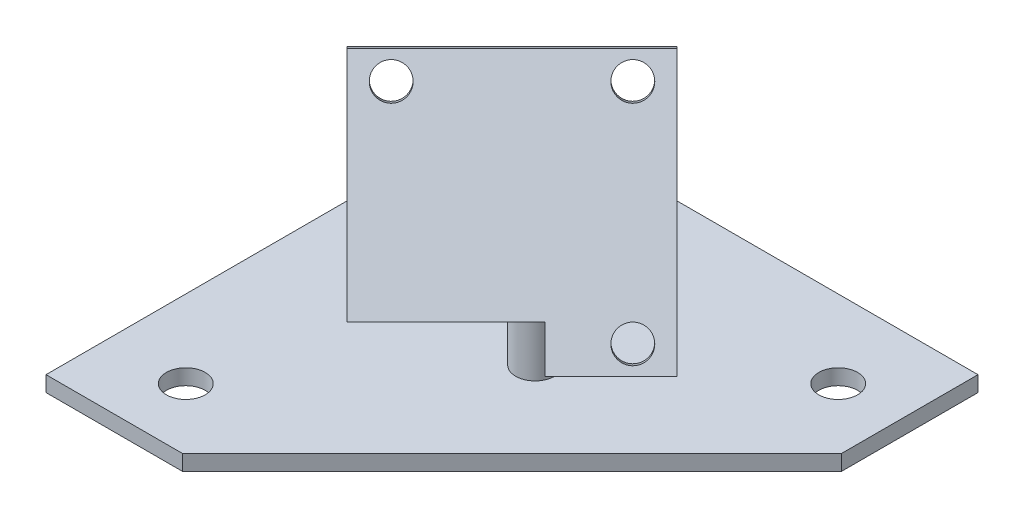
ISO-10303-21;
HEADER;
FILE_DESCRIPTION(('STEP AP214'),'2;1');
FILE_NAME('part.step','',(''),(''),'','','');
FILE_SCHEMA(('AUTOMOTIVE_DESIGN { 1 0 10303 214 1 1 1 1 }'));
ENDSEC;
DATA;
#1=APPLICATION_CONTEXT('core data for automotive mechanical design processes');
#2=APPLICATION_PROTOCOL_DEFINITION('international standard','automotive_design',2000,#1);
#3=PRODUCT_CONTEXT('',#1,'mechanical');
#4=PRODUCT('Part','Part','',(#3));
#5=PRODUCT_RELATED_PRODUCT_CATEGORY('part','',(#4));
#6=PRODUCT_DEFINITION_FORMATION('','',#4);
#7=PRODUCT_DEFINITION_CONTEXT('part definition',#1,'design');
#8=PRODUCT_DEFINITION('design','',#6,#7);
#9=PRODUCT_DEFINITION_SHAPE('','',#8);
#10=(LENGTH_UNIT() NAMED_UNIT(*) SI_UNIT(.MILLI.,.METRE.));
#11=(NAMED_UNIT(*) PLANE_ANGLE_UNIT() SI_UNIT($,.RADIAN.));
#12=(NAMED_UNIT(*) SI_UNIT($,.STERADIAN.) SOLID_ANGLE_UNIT());
#13=UNCERTAINTY_MEASURE_WITH_UNIT(LENGTH_MEASURE(1.E-05),#10,'distance_accuracy_value','');
#14=(GEOMETRIC_REPRESENTATION_CONTEXT(3) GLOBAL_UNCERTAINTY_ASSIGNED_CONTEXT((#13)) GLOBAL_UNIT_ASSIGNED_CONTEXT((#10,
#11,#12)) REPRESENTATION_CONTEXT('',''));
#15=CARTESIAN_POINT('',(0.,0.,0.));
#16=DIRECTION('',(0.,0.,1.));
#17=DIRECTION('',(1.,0.,0.));
#18=AXIS2_PLACEMENT_3D('',#15,#16,#17);
#19=CARTESIAN_POINT('',(0.,2.,0.));
#20=DIRECTION('',(0.,0.,-1.));
#21=DIRECTION('',(-1.,0.,0.));
#22=AXIS2_PLACEMENT_3D('',#19,#20,#21);
#23=PLANE('',#22);
#24=DIRECTION('',(1.,0.,0.));
#25=VECTOR('',#24,1.);
#26=CARTESIAN_POINT('',(0.,0.,0.));
#27=LINE('',#26,#25);
#28=CARTESIAN_POINT('',(20.,0.,0.));
#29=VERTEX_POINT('',#28);
#30=CARTESIAN_POINT('',(60.,0.,0.));
#31=VERTEX_POINT('',#30);
#32=EDGE_CURVE('E135',#29,#31,#27,.T.);
#33=ORIENTED_EDGE('',*,*,#32,.F.);
#34=DIRECTION('',(0.,-1.,0.));
#35=VECTOR('',#34,1.);
#36=CARTESIAN_POINT('',(20.,2.,0.));
#37=LINE('',#36,#35);
#38=CARTESIAN_POINT('',(20.,2.,0.));
#39=VERTEX_POINT('',#38);
#40=EDGE_CURVE('E11',#39,#29,#37,.T.);
#41=ORIENTED_EDGE('',*,*,#40,.F.);
#42=DIRECTION('',(1.,0.,0.));
#43=VECTOR('',#42,1.);
#44=CARTESIAN_POINT('',(0.,2.,0.));
#45=LINE('',#44,#43);
#46=CARTESIAN_POINT('',(60.,2.,0.));
#47=VERTEX_POINT('',#46);
#48=EDGE_CURVE('E173',#39,#47,#45,.T.);
#49=ORIENTED_EDGE('',*,*,#48,.T.);
#50=DIRECTION('',(0.,-1.,0.));
#51=VECTOR('',#50,1.);
#52=CARTESIAN_POINT('',(60.,2.,0.));
#53=LINE('',#52,#51);
#54=EDGE_CURVE('E52',#47,#31,#53,.T.);
#55=ORIENTED_EDGE('',*,*,#54,.T.);
#56=EDGE_LOOP('',(#33,#41,#49,#55));
#57=FACE_BOUND('',#56,.T.);
#58=ADVANCED_FACE('F35',(#57),#23,.T.);
#59=CARTESIAN_POINT('',(20.,2.,0.));
#60=DIRECTION('',(1.,0.,0.));
#61=DIRECTION('',(0.,0.,-1.));
#62=AXIS2_PLACEMENT_3D('',#59,#60,#61);
#63=PLANE('',#62);
#64=DIRECTION('',(0.,0.,1.));
#65=VECTOR('',#64,1.);
#66=CARTESIAN_POINT('',(20.,0.,0.));
#67=LINE('',#66,#65);
#68=CARTESIAN_POINT('',(20.,0.,20.));
#69=VERTEX_POINT('',#68);
#70=EDGE_CURVE('E137',#29,#69,#67,.T.);
#71=ORIENTED_EDGE('',*,*,#70,.T.);
#72=DIRECTION('',(0.,-1.,0.));
#73=VECTOR('',#72,1.);
#74=CARTESIAN_POINT('',(20.,2.,20.));
#75=LINE('',#74,#73);
#76=CARTESIAN_POINT('',(20.,2.,20.));
#77=VERTEX_POINT('',#76);
#78=EDGE_CURVE('E44',#77,#69,#75,.T.);
#79=ORIENTED_EDGE('',*,*,#78,.F.);
#80=DIRECTION('',(0.,0.,1.));
#81=VECTOR('',#80,1.);
#82=CARTESIAN_POINT('',(20.,2.,0.));
#83=LINE('',#82,#81);
#84=EDGE_CURVE('E171',#39,#77,#83,.T.);
#85=ORIENTED_EDGE('',*,*,#84,.F.);
#86=ORIENTED_EDGE('',*,*,#40,.T.);
#87=EDGE_LOOP('',(#71,#79,#85,#86));
#88=FACE_BOUND('',#87,.T.);
#89=ADVANCED_FACE('F165',(#88),#63,.F.);
#90=CARTESIAN_POINT('',(0.,2.,20.));
#91=DIRECTION('',(0.,0.,-1.));
#92=DIRECTION('',(-1.,0.,0.));
#93=AXIS2_PLACEMENT_3D('',#90,#91,#92);
#94=PLANE('',#93);
#95=DIRECTION('',(1.,0.,0.));
#96=VECTOR('',#95,1.);
#97=CARTESIAN_POINT('',(0.,0.,20.));
#98=LINE('',#97,#96);
#99=CARTESIAN_POINT('',(0.,0.,20.));
#100=VERTEX_POINT('',#99);
#101=EDGE_CURVE('E140',#100,#69,#98,.T.);
#102=ORIENTED_EDGE('',*,*,#101,.F.);
#103=DIRECTION('',(0.,-1.,0.));
#104=VECTOR('',#103,1.);
#105=CARTESIAN_POINT('',(0.,2.,20.));
#106=LINE('',#105,#104);
#107=CARTESIAN_POINT('',(0.,2.,20.));
#108=VERTEX_POINT('',#107);
#109=EDGE_CURVE('E156',#108,#100,#106,.T.);
#110=ORIENTED_EDGE('',*,*,#109,.F.);
#111=DIRECTION('',(1.,0.,0.));
#112=VECTOR('',#111,1.);
#113=CARTESIAN_POINT('',(0.,2.,20.));
#114=LINE('',#113,#112);
#115=EDGE_CURVE('E162',#108,#77,#114,.T.);
#116=ORIENTED_EDGE('',*,*,#115,.T.);
#117=ORIENTED_EDGE('',*,*,#78,.T.);
#118=EDGE_LOOP('',(#102,#110,#116,#117));
#119=FACE_BOUND('',#118,.T.);
#120=ADVANCED_FACE('F161',(#119),#94,.T.);
#121=CARTESIAN_POINT('',(0.,2.,0.));
#122=DIRECTION('',(1.,0.,0.));
#123=DIRECTION('',(0.,0.,-1.));
#124=AXIS2_PLACEMENT_3D('',#121,#122,#123);
#125=PLANE('',#124);
#126=DIRECTION('',(0.,0.,1.));
#127=VECTOR('',#126,1.);
#128=CARTESIAN_POINT('',(0.,0.,0.));
#129=LINE('',#128,#127);
#130=CARTESIAN_POINT('',(0.,0.,60.));
#131=VERTEX_POINT('',#130);
#132=EDGE_CURVE('E143',#100,#131,#129,.T.);
#133=ORIENTED_EDGE('',*,*,#132,.T.);
#134=DIRECTION('',(0.,-1.,0.));
#135=VECTOR('',#134,1.);
#136=CARTESIAN_POINT('',(0.,2.,60.));
#137=LINE('',#136,#135);
#138=CARTESIAN_POINT('',(0.,2.,60.));
#139=VERTEX_POINT('',#138);
#140=EDGE_CURVE('E120',#139,#131,#137,.T.);
#141=ORIENTED_EDGE('',*,*,#140,.F.);
#142=DIRECTION('',(0.,0.,1.));
#143=VECTOR('',#142,1.);
#144=CARTESIAN_POINT('',(0.,2.,0.));
#145=LINE('',#144,#143);
#146=EDGE_CURVE('E109',#108,#139,#145,.T.);
#147=ORIENTED_EDGE('',*,*,#146,.F.);
#148=ORIENTED_EDGE('',*,*,#109,.T.);
#149=EDGE_LOOP('',(#133,#141,#147,#148));
#150=FACE_BOUND('',#149,.T.);
#151=ADVANCED_FACE('F170',(#150),#125,.F.);
#152=CARTESIAN_POINT('',(0.,2.,60.));
#153=DIRECTION('',(0.,0.,-1.));
#154=DIRECTION('',(-1.,0.,0.));
#155=AXIS2_PLACEMENT_3D('',#152,#153,#154);
#156=PLANE('',#155);
#157=DIRECTION('',(1.,0.,0.));
#158=VECTOR('',#157,1.);
#159=CARTESIAN_POINT('',(0.,0.,60.));
#160=LINE('',#159,#158);
#161=CARTESIAN_POINT('',(17.5735931288071,0.,60.));
#162=VERTEX_POINT('',#161);
#163=EDGE_CURVE('E117',#131,#162,#160,.T.);
#164=ORIENTED_EDGE('',*,*,#163,.T.);
#165=DIRECTION('',(0.,-1.,0.));
#166=VECTOR('',#165,1.);
#167=CARTESIAN_POINT('',(17.5735931288071,2.,60.));
#168=LINE('',#167,#166);
#169=CARTESIAN_POINT('',(17.5735931288071,2.,60.));
#170=VERTEX_POINT('',#169);
#171=EDGE_CURVE('E115',#170,#162,#168,.T.);
#172=ORIENTED_EDGE('',*,*,#171,.F.);
#173=DIRECTION('',(1.,0.,0.));
#174=VECTOR('',#173,1.);
#175=CARTESIAN_POINT('',(0.,2.,60.));
#176=LINE('',#175,#174);
#177=EDGE_CURVE('E100',#139,#170,#176,.T.);
#178=ORIENTED_EDGE('',*,*,#177,.F.);
#179=ORIENTED_EDGE('',*,*,#140,.T.);
#180=EDGE_LOOP('',(#164,#172,#178,#179));
#181=FACE_BOUND('',#180,.T.);
#182=ADVANCED_FACE('F116',(#181),#156,.F.);
#183=CARTESIAN_POINT('',(38.7867965644036,2.,38.7867965644036));
#184=DIRECTION('',(0.707106781186547,0.,0.707106781186547));
#185=DIRECTION('',(0.707106781186548,0.,-0.707106781186548));
#186=AXIS2_PLACEMENT_3D('',#183,#184,#185);
#187=PLANE('',#186);
#188=DIRECTION('',(-0.707106781186548,0.,0.707106781186548));
#189=VECTOR('',#188,1.);
#190=CARTESIAN_POINT('',(38.7867965644036,0.,38.7867965644036));
#191=LINE('',#190,#189);
#192=CARTESIAN_POINT('',(60.,0.,17.5735931288071));
#193=VERTEX_POINT('',#192);
#194=EDGE_CURVE('E147',#193,#162,#191,.T.);
#195=ORIENTED_EDGE('',*,*,#194,.F.);
#196=DIRECTION('',(0.,-1.,0.));
#197=VECTOR('',#196,1.);
#198=CARTESIAN_POINT('',(60.,2.,17.5735931288071));
#199=LINE('',#198,#197);
#200=CARTESIAN_POINT('',(60.,2.,17.5735931288071));
#201=VERTEX_POINT('',#200);
#202=EDGE_CURVE('E75',#201,#193,#199,.T.);
#203=ORIENTED_EDGE('',*,*,#202,.F.);
#204=DIRECTION('',(-0.707106781186548,0.,0.707106781186548));
#205=VECTOR('',#204,1.);
#206=CARTESIAN_POINT('',(38.7867965644036,2.,38.7867965644036));
#207=LINE('',#206,#205);
#208=EDGE_CURVE('E106',#201,#170,#207,.T.);
#209=ORIENTED_EDGE('',*,*,#208,.T.);
#210=ORIENTED_EDGE('',*,*,#171,.T.);
#211=EDGE_LOOP('',(#195,#203,#209,#210));
#212=FACE_BOUND('',#211,.T.);
#213=ADVANCED_FACE('F122',(#212),#187,.T.);
#214=CARTESIAN_POINT('',(10.,2.,52.));
#215=DIRECTION('',(0.,-1.,0.));
#216=DIRECTION('',(0.,0.,-1.));
#217=AXIS2_PLACEMENT_3D('',#214,#215,#216);
#218=CYLINDRICAL_SURFACE('',#217,2.5);
#219=CARTESIAN_POINT('',(10.,2.,52.));
#220=DIRECTION('',(0.,1.,0.));
#221=DIRECTION('',(0.,0.,1.));
#222=AXIS2_PLACEMENT_3D('',#219,#220,#221);
#223=CIRCLE('',#222,2.5);
#224=CARTESIAN_POINT('',(10.,2.,54.5));
#225=VERTEX_POINT('',#224);
#226=EDGE_CURVE('E177',#225,#225,#223,.T.);
#227=ORIENTED_EDGE('',*,*,#226,.T.);
#228=EDGE_LOOP('',(#227));
#229=FACE_BOUND('',#228,.T.);
#230=CARTESIAN_POINT('',(10.,0.,52.));
#231=DIRECTION('',(0.,1.,0.));
#232=DIRECTION('',(0.,0.,1.));
#233=AXIS2_PLACEMENT_3D('',#230,#231,#232);
#234=CIRCLE('',#233,2.5);
#235=CARTESIAN_POINT('',(10.,0.,54.5));
#236=VERTEX_POINT('',#235);
#237=EDGE_CURVE('E131',#236,#236,#234,.T.);
#238=ORIENTED_EDGE('',*,*,#237,.F.);
#239=EDGE_LOOP('',(#238));
#240=FACE_BOUND('',#239,.T.);
#241=ADVANCED_FACE('F295',(#229,#240),#218,.F.);
#242=CARTESIAN_POINT('',(52.,2.,10.));
#243=DIRECTION('',(0.,-1.,0.));
#244=DIRECTION('',(0.,0.,-1.));
#245=AXIS2_PLACEMENT_3D('',#242,#243,#244);
#246=CYLINDRICAL_SURFACE('',#245,2.5);
#247=CARTESIAN_POINT('',(52.,2.,10.));
#248=DIRECTION('',(0.,1.,0.));
#249=DIRECTION('',(0.,0.,1.));
#250=AXIS2_PLACEMENT_3D('',#247,#248,#249);
#251=CIRCLE('',#250,2.5);
#252=CARTESIAN_POINT('',(52.,2.,12.5));
#253=VERTEX_POINT('',#252);
#254=EDGE_CURVE('E152',#253,#253,#251,.T.);
#255=ORIENTED_EDGE('',*,*,#254,.T.);
#256=EDGE_LOOP('',(#255));
#257=FACE_BOUND('',#256,.T.);
#258=CARTESIAN_POINT('',(52.,0.,10.));
#259=DIRECTION('',(0.,1.,0.));
#260=DIRECTION('',(0.,0.,1.));
#261=AXIS2_PLACEMENT_3D('',#258,#259,#260);
#262=CIRCLE('',#261,2.5);
#263=CARTESIAN_POINT('',(52.,0.,12.5));
#264=VERTEX_POINT('',#263);
#265=EDGE_CURVE('E128',#264,#264,#262,.T.);
#266=ORIENTED_EDGE('',*,*,#265,.F.);
#267=EDGE_LOOP('',(#266));
#268=FACE_BOUND('',#267,.T.);
#269=ADVANCED_FACE('F37',(#257,#268),#246,.F.);
#270=CARTESIAN_POINT('',(60.,2.,0.));
#271=DIRECTION('',(1.,0.,0.));
#272=DIRECTION('',(0.,0.,-1.));
#273=AXIS2_PLACEMENT_3D('',#270,#271,#272);
#274=PLANE('',#273);
#275=DIRECTION('',(0.,0.,1.));
#276=VECTOR('',#275,1.);
#277=CARTESIAN_POINT('',(60.,0.,0.));
#278=LINE('',#277,#276);
#279=EDGE_CURVE('E149',#31,#193,#278,.T.);
#280=ORIENTED_EDGE('',*,*,#279,.F.);
#281=ORIENTED_EDGE('',*,*,#54,.F.);
#282=DIRECTION('',(0.,0.,1.));
#283=VECTOR('',#282,1.);
#284=CARTESIAN_POINT('',(60.,2.,0.));
#285=LINE('',#284,#283);
#286=EDGE_CURVE('E123',#47,#201,#285,.T.);
#287=ORIENTED_EDGE('',*,*,#286,.T.);
#288=ORIENTED_EDGE('',*,*,#202,.T.);
#289=EDGE_LOOP('',(#280,#281,#287,#288));
#290=FACE_BOUND('',#289,.T.);
#291=ADVANCED_FACE('F302',(#290),#274,.T.);
#292=CARTESIAN_POINT('',(0.,2.,0.));
#293=DIRECTION('',(0.,1.,0.));
#294=DIRECTION('',(0.,0.,1.));
#295=AXIS2_PLACEMENT_3D('',#292,#293,#294);
#296=PLANE('',#295);
#297=CARTESIAN_POINT('',(30.4269297897974,2.,27.4459223568257));
#298=DIRECTION('',(0.,1.,0.));
#299=DIRECTION('',(0.,0.,1.));
#300=AXIS2_PLACEMENT_3D('',#297,#298,#299);
#301=CIRCLE('',#300,2.5);
#302=CARTESIAN_POINT('',(30.4269297897974,2.,29.9459223568258));
#303=VERTEX_POINT('',#302);
#304=EDGE_CURVE('E184',#303,#303,#301,.T.);
#305=ORIENTED_EDGE('',*,*,#304,.F.);
#306=EDGE_LOOP('',(#305));
#307=FACE_BOUND('',#306,.T.);
#308=ORIENTED_EDGE('',*,*,#254,.F.);
#309=EDGE_LOOP('',(#308));
#310=FACE_BOUND('',#309,.T.);
#311=ORIENTED_EDGE('',*,*,#226,.F.);
#312=EDGE_LOOP('',(#311));
#313=FACE_BOUND('',#312,.T.);
#314=ORIENTED_EDGE('',*,*,#48,.F.);
#315=ORIENTED_EDGE('',*,*,#84,.T.);
#316=ORIENTED_EDGE('',*,*,#115,.F.);
#317=ORIENTED_EDGE('',*,*,#146,.T.);
#318=ORIENTED_EDGE('',*,*,#177,.T.);
#319=ORIENTED_EDGE('',*,*,#208,.F.);
#320=ORIENTED_EDGE('',*,*,#286,.F.);
#321=EDGE_LOOP('',(#314,#315,#316,#317,#318,#319,#320));
#322=FACE_BOUND('',#321,.T.);
#323=ADVANCED_FACE('F103',(#307,#310,#313,#322),#296,.T.);
#324=CARTESIAN_POINT('',(0.,0.,0.));
#325=DIRECTION('',(0.,1.,0.));
#326=DIRECTION('',(0.,0.,1.));
#327=AXIS2_PLACEMENT_3D('',#324,#325,#326);
#328=PLANE('',#327);
#329=ORIENTED_EDGE('',*,*,#265,.T.);
#330=EDGE_LOOP('',(#329));
#331=FACE_BOUND('',#330,.T.);
#332=ORIENTED_EDGE('',*,*,#237,.T.);
#333=EDGE_LOOP('',(#332));
#334=FACE_BOUND('',#333,.T.);
#335=ORIENTED_EDGE('',*,*,#32,.T.);
#336=ORIENTED_EDGE('',*,*,#279,.T.);
#337=ORIENTED_EDGE('',*,*,#194,.T.);
#338=ORIENTED_EDGE('',*,*,#163,.F.);
#339=ORIENTED_EDGE('',*,*,#132,.F.);
#340=ORIENTED_EDGE('',*,*,#101,.T.);
#341=ORIENTED_EDGE('',*,*,#70,.F.);
#342=EDGE_LOOP('',(#335,#336,#337,#338,#339,#340,#341));
#343=FACE_BOUND('',#342,.T.);
#344=ADVANCED_FACE('F168',(#331,#334,#343),#328,.F.);
#345=CARTESIAN_POINT('',(30.4269297897974,36.7349831983422,27.4459223568257));
#346=DIRECTION('',(0.,-1.,0.));
#347=DIRECTION('',(0.,0.,-1.));
#348=AXIS2_PLACEMENT_3D('',#345,#346,#347);
#349=CYLINDRICAL_SURFACE('',#348,2.5);
#350=ORIENTED_EDGE('',*,*,#304,.T.);
#351=EDGE_LOOP('',(#350));
#352=FACE_BOUND('',#351,.T.);
#353=CARTESIAN_POINT('',(30.4269297897974,26.128381480544,27.4459223568257));
#354=DIRECTION('',(0.612372435695795,0.499999999999998,0.612372435695795));
#355=DIRECTION('',(0.353553390593272,-0.86602540378444,0.353553390593272));
#356=AXIS2_PLACEMENT_3D('',#353,#354,#355);
#357=ELLIPSE('',#356,5.00000000000002,2.5);
#358=CARTESIAN_POINT('',(32.1946967427638,21.7982544616218,29.2136893097921));
#359=VERTEX_POINT('',#358);
#360=EDGE_CURVE('E132',#359,#359,#357,.T.);
#361=ORIENTED_EDGE('',*,*,#360,.F.);
#362=EDGE_LOOP('',(#361));
#363=FACE_BOUND('',#362,.T.);
#364=ADVANCED_FACE('F310',(#352,#363),#349,.T.);
#365=CARTESIAN_POINT('',(33.0485350739498,25.251965084981,28.8058943868305));
#366=DIRECTION('',(-0.707106781186547,0.,0.707106781186548));
#367=DIRECTION('',(0.707106781186548,0.,0.707106781186547));
#368=AXIS2_PLACEMENT_3D('',#365,#366,#367);
#369=PLANE('',#368);
#370=DIRECTION('',(-0.353553390593273,0.86602540378444,-0.353553390593272));
#371=VECTOR('',#370,1.);
#372=CARTESIAN_POINT('',(31.8237902025582,24.251965084981,27.5811495154389));
#373=LINE('',#372,#371);
#374=CARTESIAN_POINT('',(38.3631072095293,8.23397515159766,34.12046652241));
#375=VERTEX_POINT('',#374);
#376=CARTESIAN_POINT('',(36.5953402565629,12.5641021705199,32.3526995694436));
#377=VERTEX_POINT('',#376);
#378=EDGE_CURVE('E228',#375,#377,#373,.T.);
#379=ORIENTED_EDGE('',*,*,#378,.F.);
#380=DIRECTION('',(-0.612372435695795,-0.499999999999998,-0.612372435695795));
#381=VECTOR('',#380,1.);
#382=CARTESIAN_POINT('',(39.5878520809209,9.23397515159765,35.3452113938016));
#383=LINE('',#382,#381);
#384=CARTESIAN_POINT('',(39.5878520809209,9.23397515159765,35.3452113938016));
#385=VERTEX_POINT('',#384);
#386=EDGE_CURVE('E187',#385,#375,#383,.T.);
#387=ORIENTED_EDGE('',*,*,#386,.F.);
#388=DIRECTION('',(-0.353553390593273,0.86602540378444,-0.353553390593272));
#389=VECTOR('',#388,1.);
#390=CARTESIAN_POINT('',(33.0485350739498,25.251965084981,28.8058943868305));
#391=LINE('',#390,#389);
#392=CARTESIAN_POINT('',(37.8200851279545,13.5641021705199,33.5774444408352));
#393=VERTEX_POINT('',#392);
#394=EDGE_CURVE('E254',#385,#393,#391,.T.);
#395=ORIENTED_EDGE('',*,*,#394,.T.);
#396=DIRECTION('',(-0.612372435695795,-0.499999999999998,-0.612372435695795));
#397=VECTOR('',#396,1.);
#398=CARTESIAN_POINT('',(37.8200851279545,13.5641021705199,33.5774444408352));
#399=LINE('',#398,#397);
#400=EDGE_CURVE('E202',#393,#377,#399,.T.);
#401=ORIENTED_EDGE('',*,*,#400,.T.);
#402=EDGE_LOOP('',(#379,#387,#395,#401));
#403=FACE_BOUND('',#402,.T.);
#404=ADVANCED_FACE('F317',(#403),#369,.T.);
#405=CARTESIAN_POINT('',(37.4665317373612,9.23397515159765,37.4665317373612));
#406=DIRECTION('',(0.353553390593272,-0.86602540378444,0.353553390593273));
#407=DIRECTION('',(0.,-0.377964473009226,-0.925820099772552));
#408=AXIS2_PLACEMENT_3D('',#405,#406,#407);
#409=PLANE('',#408);
#410=DIRECTION('',(-0.707106781186548,0.,0.707106781186547));
#411=VECTOR('',#410,1.);
#412=CARTESIAN_POINT('',(36.2417868659696,8.23397515159766,36.2417868659696));
#413=LINE('',#412,#411);
#414=CARTESIAN_POINT('',(46.8483885837678,8.23397515159765,25.6351851481714));
#415=VERTEX_POINT('',#414);
#416=EDGE_CURVE('E225',#415,#375,#413,.T.);
#417=ORIENTED_EDGE('',*,*,#416,.F.);
#418=DIRECTION('',(-0.612372435695795,-0.499999999999998,-0.612372435695795));
#419=VECTOR('',#418,1.);
#420=CARTESIAN_POINT('',(48.0731334551594,9.23397515159765,26.859930019563));
#421=LINE('',#420,#419);
#422=CARTESIAN_POINT('',(48.0731334551594,9.23397515159765,26.859930019563));
#423=VERTEX_POINT('',#422);
#424=EDGE_CURVE('E190',#423,#415,#421,.T.);
#425=ORIENTED_EDGE('',*,*,#424,.F.);
#426=DIRECTION('',(-0.707106781186548,0.,0.707106781186547));
#427=VECTOR('',#426,1.);
#428=CARTESIAN_POINT('',(37.4665317373612,9.23397515159765,37.4665317373612));
#429=LINE('',#428,#427);
#430=EDGE_CURVE('E251',#423,#385,#429,.T.);
#431=ORIENTED_EDGE('',*,*,#430,.T.);
#432=ORIENTED_EDGE('',*,*,#386,.T.);
#433=EDGE_LOOP('',(#417,#425,#431,#432));
#434=FACE_BOUND('',#433,.T.);
#435=ADVANCED_FACE('F387',(#434),#409,.T.);
#436=CARTESIAN_POINT('',(41.5338164481883,25.251965084981,20.3206130125919));
#437=DIRECTION('',(-0.707106781186547,0.,0.707106781186547));
#438=DIRECTION('',(0.707106781186548,0.,0.707106781186548));
#439=AXIS2_PLACEMENT_3D('',#436,#437,#438);
#440=PLANE('',#439);
#441=DIRECTION('',(-0.353553390593272,0.86602540378444,-0.353553390593272));
#442=VECTOR('',#441,1.);
#443=CARTESIAN_POINT('',(40.3090715767968,24.251965084981,19.0958681412003));
#444=LINE('',#443,#442);
#445=CARTESIAN_POINT('',(36.2417868659697,34.2147372651309,15.0285834303732));
#446=VERTEX_POINT('',#445);
#447=EDGE_CURVE('E222',#415,#446,#444,.T.);
#448=ORIENTED_EDGE('',*,*,#447,.T.);
#449=DIRECTION('',(-0.612372435695795,-0.499999999999998,-0.612372435695795));
#450=VECTOR('',#449,1.);
#451=CARTESIAN_POINT('',(37.4665317373613,35.2147372651308,16.2533283017648));
#452=LINE('',#451,#450);
#453=CARTESIAN_POINT('',(37.4665317373613,35.2147372651308,16.2533283017648));
#454=VERTEX_POINT('',#453);
#455=EDGE_CURVE('E193',#454,#446,#452,.T.);
#456=ORIENTED_EDGE('',*,*,#455,.F.);
#457=DIRECTION('',(-0.353553390593272,0.86602540378444,-0.353553390593272));
#458=VECTOR('',#457,1.);
#459=CARTESIAN_POINT('',(41.5338164481883,25.251965084981,20.3206130125919));
#460=LINE('',#459,#458);
#461=EDGE_CURVE('E248',#423,#454,#460,.T.);
#462=ORIENTED_EDGE('',*,*,#461,.F.);
#463=ORIENTED_EDGE('',*,*,#424,.T.);
#464=EDGE_LOOP('',(#448,#456,#462,#463));
#465=FACE_BOUND('',#464,.T.);
#466=ADVANCED_FACE('F397',(#465),#440,.F.);
#467=CARTESIAN_POINT('',(26.859930019563,35.2147372651308,26.859930019563));
#468=DIRECTION('',(0.353553390593272,-0.86602540378444,0.353553390593272));
#469=DIRECTION('',(0.,-0.377964473009226,-0.925820099772552));
#470=AXIS2_PLACEMENT_3D('',#467,#468,#469);
#471=PLANE('',#470);
#472=DIRECTION('',(-0.707106781186547,0.,0.707106781186548));
#473=VECTOR('',#472,1.);
#474=CARTESIAN_POINT('',(25.6351851481715,34.2147372651309,25.6351851481715));
#475=LINE('',#474,#473);
#476=CARTESIAN_POINT('',(15.0285834303732,34.2147372651309,36.2417868659697));
#477=VERTEX_POINT('',#476);
#478=EDGE_CURVE('E219',#446,#477,#475,.T.);
#479=ORIENTED_EDGE('',*,*,#478,.T.);
#480=DIRECTION('',(-0.612372435695795,-0.499999999999998,-0.612372435695795));
#481=VECTOR('',#480,1.);
#482=CARTESIAN_POINT('',(16.2533283017648,35.2147372651309,37.4665317373613));
#483=LINE('',#482,#481);
#484=CARTESIAN_POINT('',(16.2533283017648,35.2147372651309,37.4665317373613));
#485=VERTEX_POINT('',#484);
#486=EDGE_CURVE('E196',#485,#477,#483,.T.);
#487=ORIENTED_EDGE('',*,*,#486,.F.);
#488=DIRECTION('',(-0.707106781186547,0.,0.707106781186548));
#489=VECTOR('',#488,1.);
#490=CARTESIAN_POINT('',(26.859930019563,35.2147372651308,26.859930019563));
#491=LINE('',#490,#489);
#492=EDGE_CURVE('E245',#454,#485,#491,.T.);
#493=ORIENTED_EDGE('',*,*,#492,.F.);
#494=ORIENTED_EDGE('',*,*,#455,.T.);
#495=EDGE_LOOP('',(#479,#487,#493,#494));
#496=FACE_BOUND('',#495,.T.);
#497=ADVANCED_FACE('F407',(#496),#471,.F.);
#498=CARTESIAN_POINT('',(20.3206130125919,25.251965084981,41.5338164481883));
#499=DIRECTION('',(-0.707106781186547,0.,0.707106781186548));
#500=DIRECTION('',(0.707106781186548,0.,0.707106781186547));
#501=AXIS2_PLACEMENT_3D('',#498,#499,#500);
#502=PLANE('',#501);
#503=DIRECTION('',(-0.353553390593273,0.86602540378444,-0.353553390593272));
#504=VECTOR('',#503,1.);
#505=CARTESIAN_POINT('',(19.0958681412003,24.251965084981,40.3090715767968));
#506=LINE('',#505,#504);
#507=CARTESIAN_POINT('',(23.8674181952051,12.5641021705198,45.0806216308015));
#508=VERTEX_POINT('',#507);
#509=EDGE_CURVE('E216',#508,#477,#506,.T.);
#510=ORIENTED_EDGE('',*,*,#509,.F.);
#511=DIRECTION('',(-0.612372435695795,-0.499999999999998,-0.612372435695795));
#512=VECTOR('',#511,1.);
#513=CARTESIAN_POINT('',(25.0921630665966,13.5641021705198,46.3053665021931));
#514=LINE('',#513,#512);
#515=CARTESIAN_POINT('',(25.0921630665966,13.5641021705198,46.3053665021931));
#516=VERTEX_POINT('',#515);
#517=EDGE_CURVE('E199',#516,#508,#514,.T.);
#518=ORIENTED_EDGE('',*,*,#517,.F.);
#519=DIRECTION('',(-0.353553390593273,0.86602540378444,-0.353553390593272));
#520=VECTOR('',#519,1.);
#521=CARTESIAN_POINT('',(20.3206130125919,25.251965084981,41.5338164481883));
#522=LINE('',#521,#520);
#523=EDGE_CURVE('E242',#516,#485,#522,.T.);
#524=ORIENTED_EDGE('',*,*,#523,.T.);
#525=ORIENTED_EDGE('',*,*,#486,.T.);
#526=EDGE_LOOP('',(#510,#518,#524,#525));
#527=FACE_BOUND('',#526,.T.);
#528=ADVANCED_FACE('F417',(#527),#502,.T.);
#529=CARTESIAN_POINT('',(20.1424155982909,32.6166610537775,35.6987647843949));
#530=DIRECTION('',(-0.612372435695795,-0.499999999999998,-0.612372435695795));
#531=DIRECTION('',(-0.707106781186547,0.,0.707106781186547));
#532=AXIS2_PLACEMENT_3D('',#529,#530,#531);
#533=CYLINDRICAL_SURFACE('',#532,2.);
#534=CARTESIAN_POINT('',(20.1424155982909,32.6166610537775,35.6987647843949));
#535=DIRECTION('',(0.612372435695795,0.499999999999998,0.612372435695795));
#536=DIRECTION('',(0.707106781186547,0.,-0.707106781186547));
#537=AXIS2_PLACEMENT_3D('',#534,#535,#536);
#538=CIRCLE('',#537,2.);
#539=CARTESIAN_POINT('',(21.5566291606639,32.6166610537775,34.2845512220218));
#540=VERTEX_POINT('',#539);
#541=EDGE_CURVE('E236',#540,#540,#538,.T.);
#542=ORIENTED_EDGE('',*,*,#541,.T.);
#543=EDGE_LOOP('',(#542));
#544=FACE_BOUND('',#543,.T.);
#545=CARTESIAN_POINT('',(18.9176707268993,31.6166610537775,34.4740199130033));
#546=DIRECTION('',(0.612372435695795,0.499999999999998,0.612372435695795));
#547=DIRECTION('',(0.707106781186547,0.,-0.707106781186547));
#548=AXIS2_PLACEMENT_3D('',#545,#546,#547);
#549=CIRCLE('',#548,2.);
#550=CARTESIAN_POINT('',(20.3318842892724,31.6166610537775,33.0598063506302));
#551=VERTEX_POINT('',#550);
#552=EDGE_CURVE('E210',#551,#551,#549,.T.);
#553=ORIENTED_EDGE('',*,*,#552,.F.);
#554=EDGE_LOOP('',(#553));
#555=FACE_BOUND('',#554,.T.);
#556=ADVANCED_FACE('F427',(#544,#555),#533,.F.);
#557=CARTESIAN_POINT('',(35.6987647843949,13.5641021705199,35.6987647843949));
#558=DIRECTION('',(-0.353553390593272,0.86602540378444,-0.353553390593272));
#559=DIRECTION('',(-0.925820099772552,-0.377964473009226,0.));
#560=AXIS2_PLACEMENT_3D('',#557,#558,#559);
#561=PLANE('',#560);
#562=DIRECTION('',(0.707106781186547,0.,-0.707106781186548));
#563=VECTOR('',#562,1.);
#564=CARTESIAN_POINT('',(34.4740199130033,12.5641021705199,34.4740199130033));
#565=LINE('',#564,#563);
#566=EDGE_CURVE('E213',#508,#377,#565,.T.);
#567=ORIENTED_EDGE('',*,*,#566,.T.);
#568=ORIENTED_EDGE('',*,*,#400,.F.);
#569=DIRECTION('',(0.707106781186547,0.,-0.707106781186548));
#570=VECTOR('',#569,1.);
#571=CARTESIAN_POINT('',(35.6987647843949,13.5641021705199,35.6987647843949));
#572=LINE('',#571,#570);
#573=EDGE_CURVE('E239',#516,#393,#572,.T.);
#574=ORIENTED_EDGE('',*,*,#573,.F.);
#575=ORIENTED_EDGE('',*,*,#517,.T.);
#576=EDGE_LOOP('',(#567,#568,#574,#575));
#577=FACE_BOUND('',#576,.T.);
#578=ADVANCED_FACE('F437',(#577),#561,.F.);
#579=CARTESIAN_POINT('',(44.1840461586334,11.832051362951,28.6276969725294));
#580=DIRECTION('',(-0.612372435695795,-0.499999999999998,-0.612372435695795));
#581=DIRECTION('',(-0.707106781186547,0.,0.707106781186547));
#582=AXIS2_PLACEMENT_3D('',#579,#580,#581);
#583=CYLINDRICAL_SURFACE('',#582,2.);
#584=CARTESIAN_POINT('',(44.1840461586334,11.832051362951,28.6276969725294));
#585=DIRECTION('',(0.612372435695795,0.499999999999998,0.612372435695795));
#586=DIRECTION('',(0.707106781186547,0.,-0.707106781186547));
#587=AXIS2_PLACEMENT_3D('',#584,#585,#586);
#588=CIRCLE('',#587,2.);
#589=CARTESIAN_POINT('',(45.5982597210065,11.832051362951,27.2134834101563));
#590=VERTEX_POINT('',#589);
#591=EDGE_CURVE('E209',#590,#590,#588,.T.);
#592=ORIENTED_EDGE('',*,*,#591,.T.);
#593=EDGE_LOOP('',(#592));
#594=FACE_BOUND('',#593,.T.);
#595=CARTESIAN_POINT('',(42.9593012872418,10.832051362951,27.4029521011378));
#596=DIRECTION('',(0.612372435695795,0.499999999999998,0.612372435695795));
#597=DIRECTION('',(0.707106781186547,0.,-0.707106781186547));
#598=AXIS2_PLACEMENT_3D('',#595,#596,#597);
#599=CIRCLE('',#598,2.);
#600=CARTESIAN_POINT('',(44.3735148496149,10.832051362951,25.9887385387647));
#601=VERTEX_POINT('',#600);
#602=EDGE_CURVE('E231',#601,#601,#599,.T.);
#603=ORIENTED_EDGE('',*,*,#602,.F.);
#604=EDGE_LOOP('',(#603));
#605=FACE_BOUND('',#604,.T.);
#606=ADVANCED_FACE('F260',(#594,#605),#583,.F.);
#607=CARTESIAN_POINT('',(35.6987647843949,32.6166610537775,20.1424155982909));
#608=DIRECTION('',(-0.612372435695795,-0.499999999999998,-0.612372435695795));
#609=DIRECTION('',(-0.707106781186547,0.,0.707106781186547));
#610=AXIS2_PLACEMENT_3D('',#607,#608,#609);
#611=CYLINDRICAL_SURFACE('',#610,2.);
#612=CARTESIAN_POINT('',(35.6987647843949,32.6166610537775,20.1424155982909));
#613=DIRECTION('',(0.612372435695795,0.499999999999998,0.612372435695795));
#614=DIRECTION('',(0.707106781186547,0.,-0.707106781186547));
#615=AXIS2_PLACEMENT_3D('',#612,#613,#614);
#616=CIRCLE('',#615,2.);
#617=CARTESIAN_POINT('',(37.112978346768,32.6166610537775,18.7282020359178));
#618=VERTEX_POINT('',#617);
#619=EDGE_CURVE('E205',#618,#618,#616,.F.);
#620=ORIENTED_EDGE('',*,*,#619,.F.);
#621=EDGE_LOOP('',(#620));
#622=FACE_BOUND('',#621,.T.);
#623=CARTESIAN_POINT('',(34.4740199130033,31.6166610537775,18.9176707268993));
#624=DIRECTION('',(0.612372435695795,0.499999999999998,0.612372435695795));
#625=DIRECTION('',(0.707106781186547,0.,-0.707106781186547));
#626=AXIS2_PLACEMENT_3D('',#623,#624,#625);
#627=CIRCLE('',#626,2.);
#628=CARTESIAN_POINT('',(35.8882334753764,31.6166610537775,17.5034571645262));
#629=VERTEX_POINT('',#628);
#630=EDGE_CURVE('E206',#629,#629,#627,.F.);
#631=ORIENTED_EDGE('',*,*,#630,.T.);
#632=EDGE_LOOP('',(#631));
#633=FACE_BOUND('',#632,.T.);
#634=ADVANCED_FACE('F267',(#622,#633),#611,.F.);
#635=CARTESIAN_POINT('',(30.9272147303901,25.251965084981,30.9272147303901));
#636=DIRECTION('',(0.612372435695795,0.499999999999998,0.612372435695795));
#637=DIRECTION('',(0.707106781186547,0.,-0.707106781186547));
#638=AXIS2_PLACEMENT_3D('',#635,#636,#637);
#639=PLANE('',#638);
#640=ORIENTED_EDGE('',*,*,#591,.F.);
#641=EDGE_LOOP('',(#640));
#642=FACE_BOUND('',#641,.T.);
#643=ORIENTED_EDGE('',*,*,#394,.F.);
#644=ORIENTED_EDGE('',*,*,#430,.F.);
#645=ORIENTED_EDGE('',*,*,#461,.T.);
#646=ORIENTED_EDGE('',*,*,#492,.T.);
#647=ORIENTED_EDGE('',*,*,#523,.F.);
#648=ORIENTED_EDGE('',*,*,#573,.T.);
#649=EDGE_LOOP('',(#643,#644,#645,#646,#647,#648));
#650=FACE_BOUND('',#649,.T.);
#651=ORIENTED_EDGE('',*,*,#541,.F.);
#652=EDGE_LOOP('',(#651));
#653=FACE_BOUND('',#652,.T.);
#654=ORIENTED_EDGE('',*,*,#619,.T.);
#655=EDGE_LOOP('',(#654));
#656=FACE_BOUND('',#655,.T.);
#657=ADVANCED_FACE('F263',(#642,#650,#653,#656),#639,.T.);
#658=CARTESIAN_POINT('',(29.7024698589985,24.251965084981,29.7024698589985));
#659=DIRECTION('',(0.612372435695795,0.499999999999998,0.612372435695795));
#660=DIRECTION('',(0.707106781186547,0.,-0.707106781186547));
#661=AXIS2_PLACEMENT_3D('',#658,#659,#660);
#662=PLANE('',#661);
#663=ORIENTED_EDGE('',*,*,#360,.T.);
#664=EDGE_LOOP('',(#663));
#665=FACE_BOUND('',#664,.T.);
#666=ORIENTED_EDGE('',*,*,#602,.T.);
#667=EDGE_LOOP('',(#666));
#668=FACE_BOUND('',#667,.T.);
#669=ORIENTED_EDGE('',*,*,#378,.T.);
#670=ORIENTED_EDGE('',*,*,#566,.F.);
#671=ORIENTED_EDGE('',*,*,#509,.T.);
#672=ORIENTED_EDGE('',*,*,#478,.F.);
#673=ORIENTED_EDGE('',*,*,#447,.F.);
#674=ORIENTED_EDGE('',*,*,#416,.T.);
#675=EDGE_LOOP('',(#669,#670,#671,#672,#673,#674));
#676=FACE_BOUND('',#675,.T.);
#677=ORIENTED_EDGE('',*,*,#552,.T.);
#678=EDGE_LOOP('',(#677));
#679=FACE_BOUND('',#678,.T.);
#680=ORIENTED_EDGE('',*,*,#630,.F.);
#681=EDGE_LOOP('',(#680));
#682=FACE_BOUND('',#681,.T.);
#683=ADVANCED_FACE('F266',(#665,#668,#676,#679,#682),#662,.F.);
#684=CLOSED_SHELL('',(#58,#89,#120,#151,#182,#213,#241,#269,#291,#323,#344,#364,#404,#435,#466,
#497,#528,#556,#578,#606,#634,#657,#683));
#685=MANIFOLD_SOLID_BREP('B2',#684);
#686=ADVANCED_BREP_SHAPE_REPRESENTATION('',(#18,#685),#14);
#687=SHAPE_DEFINITION_REPRESENTATION(#9,#686);
ENDSEC;
END-ISO-10303-21;
